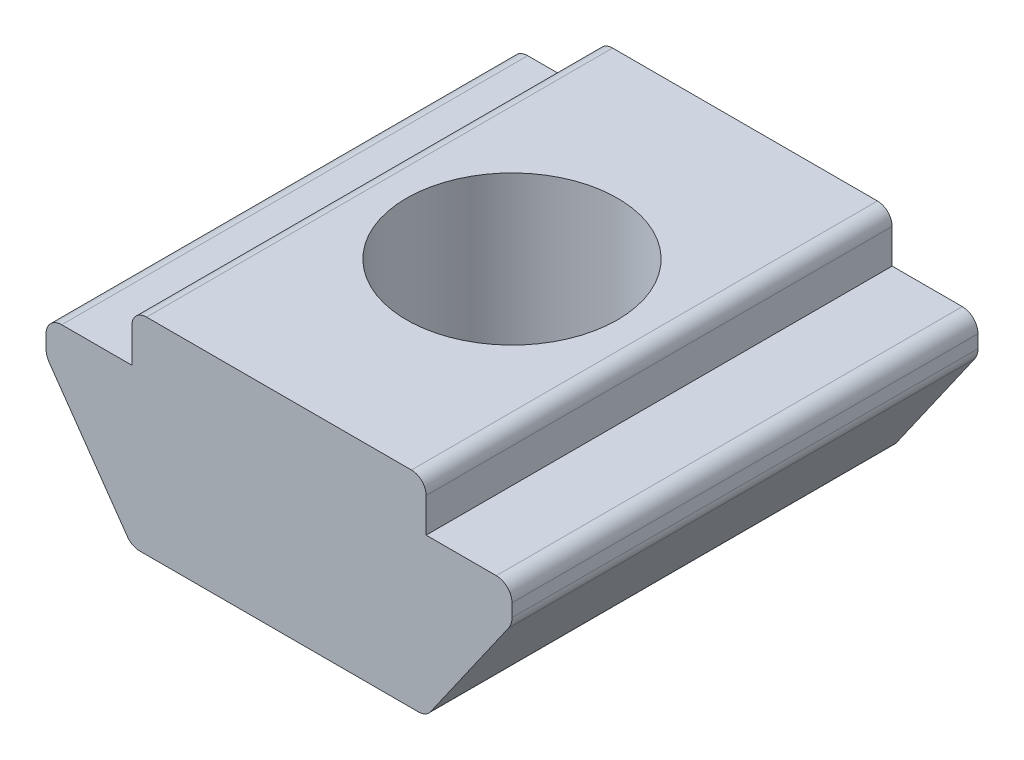
ISO-10303-21;
HEADER;
FILE_DESCRIPTION(('STEP AP214'),'2;1');
FILE_NAME('part.step','',(''),(''),'','','');
FILE_SCHEMA(('AUTOMOTIVE_DESIGN { 1 0 10303 214 1 1 1 1 }'));
ENDSEC;
DATA;
#1=APPLICATION_CONTEXT('core data for automotive mechanical design processes');
#2=APPLICATION_PROTOCOL_DEFINITION('international standard','automotive_design',2000,#1);
#3=PRODUCT_CONTEXT('',#1,'mechanical');
#4=PRODUCT('Part','Part','',(#3));
#5=PRODUCT_RELATED_PRODUCT_CATEGORY('part','',(#4));
#6=PRODUCT_DEFINITION_FORMATION('','',#4);
#7=PRODUCT_DEFINITION_CONTEXT('part definition',#1,'design');
#8=PRODUCT_DEFINITION('design','',#6,#7);
#9=PRODUCT_DEFINITION_SHAPE('','',#8);
#10=(LENGTH_UNIT() NAMED_UNIT(*) SI_UNIT(.MILLI.,.METRE.));
#11=(NAMED_UNIT(*) PLANE_ANGLE_UNIT() SI_UNIT($,.RADIAN.));
#12=(NAMED_UNIT(*) SI_UNIT($,.STERADIAN.) SOLID_ANGLE_UNIT());
#13=UNCERTAINTY_MEASURE_WITH_UNIT(LENGTH_MEASURE(1.E-05),#10,'distance_accuracy_value','');
#14=(GEOMETRIC_REPRESENTATION_CONTEXT(3) GLOBAL_UNCERTAINTY_ASSIGNED_CONTEXT((#13)) GLOBAL_UNIT_ASSIGNED_CONTEXT((#10,
#11,#12)) REPRESENTATION_CONTEXT('',''));
#15=CARTESIAN_POINT('',(0.,0.,0.));
#16=DIRECTION('',(0.,0.,1.));
#17=DIRECTION('',(1.,0.,0.));
#18=AXIS2_PLACEMENT_3D('',#15,#16,#17);
#19=CARTESIAN_POINT('',(4.375,-1.58250394237167,9.5));
#20=DIRECTION('',(0.,0.,-1.));
#21=DIRECTION('',(-1.,0.,0.));
#22=AXIS2_PLACEMENT_3D('',#19,#20,#21);
#23=CYLINDRICAL_SURFACE('',#22,0.375);
#24=CARTESIAN_POINT('',(4.375,-1.58250394237167,0.));
#25=DIRECTION('',(0.,0.,1.));
#26=DIRECTION('',(-1.,0.,0.));
#27=AXIS2_PLACEMENT_3D('',#24,#25,#26);
#28=CIRCLE('',#27,0.375);
#29=CARTESIAN_POINT('',(4.68218201660838,-1.79759510600332,0.));
#30=VERTEX_POINT('',#29);
#31=CARTESIAN_POINT('',(4.75,-1.58250394237167,0.));
#32=VERTEX_POINT('',#31);
#33=EDGE_CURVE('E214',#30,#32,#28,.T.);
#34=ORIENTED_EDGE('',*,*,#33,.T.);
#35=DIRECTION('',(0.,0.,-1.));
#36=VECTOR('',#35,1.);
#37=CARTESIAN_POINT('',(4.75,-1.58250394237167,9.5));
#38=LINE('',#37,#36);
#39=CARTESIAN_POINT('',(4.75,-1.58250394237167,9.5));
#40=VERTEX_POINT('',#39);
#41=EDGE_CURVE('E11',#40,#32,#38,.T.);
#42=ORIENTED_EDGE('',*,*,#41,.F.);
#43=CARTESIAN_POINT('',(4.375,-1.58250394237167,9.5));
#44=DIRECTION('',(0.,0.,1.));
#45=DIRECTION('',(-1.,0.,0.));
#46=AXIS2_PLACEMENT_3D('',#43,#44,#45);
#47=CIRCLE('',#46,0.375);
#48=CARTESIAN_POINT('',(4.68218201660838,-1.79759510600332,9.5));
#49=VERTEX_POINT('',#48);
#50=EDGE_CURVE('E267',#49,#40,#47,.T.);
#51=ORIENTED_EDGE('',*,*,#50,.F.);
#52=DIRECTION('',(0.,0.,-1.));
#53=VECTOR('',#52,1.);
#54=CARTESIAN_POINT('',(4.68218201660838,-1.79759510600332,9.5));
#55=LINE('',#54,#53);
#56=EDGE_CURVE('E210',#49,#30,#55,.T.);
#57=ORIENTED_EDGE('',*,*,#56,.T.);
#58=EDGE_LOOP('',(#34,#42,#51,#57));
#59=FACE_BOUND('',#58,.T.);
#60=ADVANCED_FACE('F51',(#59),#23,.T.);
#61=CARTESIAN_POINT('',(4.75,-1.32,9.5));
#62=DIRECTION('',(-1.,0.,0.));
#63=DIRECTION('',(0.,0.,1.));
#64=AXIS2_PLACEMENT_3D('',#61,#62,#63);
#65=PLANE('',#64);
#66=DIRECTION('',(0.,1.,0.));
#67=VECTOR('',#66,1.);
#68=CARTESIAN_POINT('',(4.75,-1.32,0.));
#69=LINE('',#68,#67);
#70=CARTESIAN_POINT('',(4.75,-1.32,0.));
#71=VERTEX_POINT('',#70);
#72=EDGE_CURVE('E218',#32,#71,#69,.T.);
#73=ORIENTED_EDGE('',*,*,#72,.T.);
#74=DIRECTION('',(0.,0.,-1.));
#75=VECTOR('',#74,1.);
#76=CARTESIAN_POINT('',(4.75,-1.32,9.5));
#77=LINE('',#76,#75);
#78=CARTESIAN_POINT('',(4.75,-1.32,9.5));
#79=VERTEX_POINT('',#78);
#80=EDGE_CURVE('E60',#79,#71,#77,.T.);
#81=ORIENTED_EDGE('',*,*,#80,.F.);
#82=DIRECTION('',(0.,1.,0.));
#83=VECTOR('',#82,1.);
#84=CARTESIAN_POINT('',(4.75,-1.32,9.5));
#85=LINE('',#84,#83);
#86=EDGE_CURVE('E141',#40,#79,#85,.T.);
#87=ORIENTED_EDGE('',*,*,#86,.F.);
#88=ORIENTED_EDGE('',*,*,#41,.T.);
#89=EDGE_LOOP('',(#73,#81,#87,#88));
#90=FACE_BOUND('',#89,.T.);
#91=ADVANCED_FACE('F501',(#90),#65,.F.);
#92=CARTESIAN_POINT('',(4.43,-1.32,9.5));
#93=DIRECTION('',(0.,0.,-1.));
#94=DIRECTION('',(-1.,0.,0.));
#95=AXIS2_PLACEMENT_3D('',#92,#93,#94);
#96=CYLINDRICAL_SURFACE('',#95,0.32);
#97=CARTESIAN_POINT('',(4.43,-1.32,0.));
#98=DIRECTION('',(0.,0.,1.));
#99=DIRECTION('',(-1.,0.,0.));
#100=AXIS2_PLACEMENT_3D('',#97,#98,#99);
#101=CIRCLE('',#100,0.32);
#102=CARTESIAN_POINT('',(4.43,-1.,0.));
#103=VERTEX_POINT('',#102);
#104=EDGE_CURVE('E222',#71,#103,#101,.T.);
#105=ORIENTED_EDGE('',*,*,#104,.T.);
#106=DIRECTION('',(0.,0.,-1.));
#107=VECTOR('',#106,1.);
#108=CARTESIAN_POINT('',(4.43,-1.,9.5));
#109=LINE('',#108,#107);
#110=CARTESIAN_POINT('',(4.43,-1.,9.5));
#111=VERTEX_POINT('',#110);
#112=EDGE_CURVE('E318',#111,#103,#109,.T.);
#113=ORIENTED_EDGE('',*,*,#112,.F.);
#114=CARTESIAN_POINT('',(4.43,-1.32,9.5));
#115=DIRECTION('',(0.,0.,1.));
#116=DIRECTION('',(-1.,0.,0.));
#117=AXIS2_PLACEMENT_3D('',#114,#115,#116);
#118=CIRCLE('',#117,0.32);
#119=EDGE_CURVE('E330',#79,#111,#118,.T.);
#120=ORIENTED_EDGE('',*,*,#119,.F.);
#121=ORIENTED_EDGE('',*,*,#80,.T.);
#122=EDGE_LOOP('',(#105,#113,#120,#121));
#123=FACE_BOUND('',#122,.T.);
#124=ADVANCED_FACE('F328',(#123),#96,.T.);
#125=CARTESIAN_POINT('',(3.,-1.,9.5));
#126=DIRECTION('',(0.,-1.,0.));
#127=DIRECTION('',(0.,0.,-1.));
#128=AXIS2_PLACEMENT_3D('',#125,#126,#127);
#129=PLANE('',#128);
#130=DIRECTION('',(-1.,0.,0.));
#131=VECTOR('',#130,1.);
#132=CARTESIAN_POINT('',(3.,-1.,0.));
#133=LINE('',#132,#131);
#134=CARTESIAN_POINT('',(3.,-1.,0.));
#135=VERTEX_POINT('',#134);
#136=EDGE_CURVE('E225',#103,#135,#133,.T.);
#137=ORIENTED_EDGE('',*,*,#136,.T.);
#138=DIRECTION('',(0.,0.,-1.));
#139=VECTOR('',#138,1.);
#140=CARTESIAN_POINT('',(3.,-1.,9.5));
#141=LINE('',#140,#139);
#142=CARTESIAN_POINT('',(3.,-1.,9.5));
#143=VERTEX_POINT('',#142);
#144=EDGE_CURVE('E314',#143,#135,#141,.T.);
#145=ORIENTED_EDGE('',*,*,#144,.F.);
#146=DIRECTION('',(-1.,0.,0.));
#147=VECTOR('',#146,1.);
#148=CARTESIAN_POINT('',(3.,-1.,9.5));
#149=LINE('',#148,#147);
#150=EDGE_CURVE('E349',#111,#143,#149,.T.);
#151=ORIENTED_EDGE('',*,*,#150,.F.);
#152=ORIENTED_EDGE('',*,*,#112,.T.);
#153=EDGE_LOOP('',(#137,#145,#151,#152));
#154=FACE_BOUND('',#153,.T.);
#155=ADVANCED_FACE('F339',(#154),#129,.F.);
#156=CARTESIAN_POINT('',(3.,-0.300000000000002,9.5));
#157=DIRECTION('',(-1.,0.,0.));
#158=DIRECTION('',(0.,-1.,0.));
#159=AXIS2_PLACEMENT_3D('',#156,#157,#158);
#160=PLANE('',#159);
#161=DIRECTION('',(0.,1.,0.));
#162=VECTOR('',#161,1.);
#163=CARTESIAN_POINT('',(3.,-0.300000000000002,0.));
#164=LINE('',#163,#162);
#165=CARTESIAN_POINT('',(3.,-0.300000000000002,0.));
#166=VERTEX_POINT('',#165);
#167=EDGE_CURVE('E228',#135,#166,#164,.T.);
#168=ORIENTED_EDGE('',*,*,#167,.T.);
#169=DIRECTION('',(0.,0.,-1.));
#170=VECTOR('',#169,1.);
#171=CARTESIAN_POINT('',(3.,-0.300000000000002,9.5));
#172=LINE('',#171,#170);
#173=CARTESIAN_POINT('',(3.,-0.300000000000002,9.5));
#174=VERTEX_POINT('',#173);
#175=EDGE_CURVE('E310',#174,#166,#172,.T.);
#176=ORIENTED_EDGE('',*,*,#175,.F.);
#177=DIRECTION('',(0.,1.,0.));
#178=VECTOR('',#177,1.);
#179=CARTESIAN_POINT('',(3.,-0.300000000000002,9.5));
#180=LINE('',#179,#178);
#181=EDGE_CURVE('E345',#143,#174,#180,.T.);
#182=ORIENTED_EDGE('',*,*,#181,.F.);
#183=ORIENTED_EDGE('',*,*,#144,.T.);
#184=EDGE_LOOP('',(#168,#176,#182,#183));
#185=FACE_BOUND('',#184,.T.);
#186=ADVANCED_FACE('F343',(#185),#160,.F.);
#187=CARTESIAN_POINT('',(2.7,-0.3,9.5));
#188=DIRECTION('',(0.,0.,-1.));
#189=DIRECTION('',(-1.,0.,0.));
#190=AXIS2_PLACEMENT_3D('',#187,#188,#189);
#191=CYLINDRICAL_SURFACE('',#190,0.3);
#192=CARTESIAN_POINT('',(2.7,-0.3,0.));
#193=DIRECTION('',(0.,0.,1.));
#194=DIRECTION('',(-1.,0.,0.));
#195=AXIS2_PLACEMENT_3D('',#192,#193,#194);
#196=CIRCLE('',#195,0.3);
#197=CARTESIAN_POINT('',(2.7,0.,0.));
#198=VERTEX_POINT('',#197);
#199=EDGE_CURVE('E231',#166,#198,#196,.T.);
#200=ORIENTED_EDGE('',*,*,#199,.T.);
#201=DIRECTION('',(0.,0.,-1.));
#202=VECTOR('',#201,1.);
#203=CARTESIAN_POINT('',(2.7,0.,9.5));
#204=LINE('',#203,#202);
#205=CARTESIAN_POINT('',(2.7,0.,9.5));
#206=VERTEX_POINT('',#205);
#207=EDGE_CURVE('E306',#206,#198,#204,.T.);
#208=ORIENTED_EDGE('',*,*,#207,.F.);
#209=CARTESIAN_POINT('',(2.7,-0.3,9.5));
#210=DIRECTION('',(0.,0.,1.));
#211=DIRECTION('',(-1.,0.,0.));
#212=AXIS2_PLACEMENT_3D('',#209,#210,#211);
#213=CIRCLE('',#212,0.3);
#214=EDGE_CURVE('E348',#174,#206,#213,.T.);
#215=ORIENTED_EDGE('',*,*,#214,.F.);
#216=ORIENTED_EDGE('',*,*,#175,.T.);
#217=EDGE_LOOP('',(#200,#208,#215,#216));
#218=FACE_BOUND('',#217,.T.);
#219=ADVANCED_FACE('F513',(#218),#191,.T.);
#220=CARTESIAN_POINT('',(-2.7,0.,9.5));
#221=DIRECTION('',(0.,-1.,0.));
#222=DIRECTION('',(1.,0.,0.));
#223=AXIS2_PLACEMENT_3D('',#220,#221,#222);
#224=PLANE('',#223);
#225=CARTESIAN_POINT('',(0.,0.,4.75));
#226=DIRECTION('',(0.,1.,0.));
#227=DIRECTION('',(-1.,0.,0.));
#228=AXIS2_PLACEMENT_3D('',#225,#226,#227);
#229=CIRCLE('',#228,2.15);
#230=CARTESIAN_POINT('',(-2.15,0.,4.75));
#231=VERTEX_POINT('',#230);
#232=EDGE_CURVE('E443',#231,#231,#229,.T.);
#233=ORIENTED_EDGE('',*,*,#232,.F.);
#234=EDGE_LOOP('',(#233));
#235=FACE_BOUND('',#234,.T.);
#236=DIRECTION('',(-1.,0.,0.));
#237=VECTOR('',#236,1.);
#238=CARTESIAN_POINT('',(-2.7,0.,0.));
#239=LINE('',#238,#237);
#240=CARTESIAN_POINT('',(-2.7,0.,0.));
#241=VERTEX_POINT('',#240);
#242=EDGE_CURVE('E234',#198,#241,#239,.T.);
#243=ORIENTED_EDGE('',*,*,#242,.T.);
#244=DIRECTION('',(0.,0.,-1.));
#245=VECTOR('',#244,1.);
#246=CARTESIAN_POINT('',(-2.7,0.,9.5));
#247=LINE('',#246,#245);
#248=CARTESIAN_POINT('',(-2.7,0.,9.5));
#249=VERTEX_POINT('',#248);
#250=EDGE_CURVE('E302',#249,#241,#247,.T.);
#251=ORIENTED_EDGE('',*,*,#250,.F.);
#252=DIRECTION('',(-1.,0.,0.));
#253=VECTOR('',#252,1.);
#254=CARTESIAN_POINT('',(-2.7,0.,9.5));
#255=LINE('',#254,#253);
#256=EDGE_CURVE('E355',#206,#249,#255,.T.);
#257=ORIENTED_EDGE('',*,*,#256,.F.);
#258=ORIENTED_EDGE('',*,*,#207,.T.);
#259=EDGE_LOOP('',(#243,#251,#257,#258));
#260=FACE_BOUND('',#259,.T.);
#261=ADVANCED_FACE('F516',(#235,#260),#224,.F.);
#262=CARTESIAN_POINT('',(-2.7,-0.299999999999986,9.5));
#263=DIRECTION('',(0.,0.,-1.));
#264=DIRECTION('',(-1.,0.,0.));
#265=AXIS2_PLACEMENT_3D('',#262,#263,#264);
#266=CYLINDRICAL_SURFACE('',#265,0.3);
#267=CARTESIAN_POINT('',(-2.7,-0.299999999999986,0.));
#268=DIRECTION('',(0.,0.,1.));
#269=DIRECTION('',(1.,0.,0.));
#270=AXIS2_PLACEMENT_3D('',#267,#268,#269);
#271=CIRCLE('',#270,0.3);
#272=CARTESIAN_POINT('',(-3.,-0.299999999999988,0.));
#273=VERTEX_POINT('',#272);
#274=EDGE_CURVE('E237',#241,#273,#271,.T.);
#275=ORIENTED_EDGE('',*,*,#274,.T.);
#276=DIRECTION('',(0.,0.,-1.));
#277=VECTOR('',#276,1.);
#278=CARTESIAN_POINT('',(-3.,-0.299999999999988,9.5));
#279=LINE('',#278,#277);
#280=CARTESIAN_POINT('',(-3.,-0.299999999999988,9.5));
#281=VERTEX_POINT('',#280);
#282=EDGE_CURVE('E298',#281,#273,#279,.T.);
#283=ORIENTED_EDGE('',*,*,#282,.F.);
#284=CARTESIAN_POINT('',(-2.7,-0.299999999999986,9.5));
#285=DIRECTION('',(0.,0.,1.));
#286=DIRECTION('',(1.,0.,0.));
#287=AXIS2_PLACEMENT_3D('',#284,#285,#286);
#288=CIRCLE('',#287,0.3);
#289=EDGE_CURVE('E362',#249,#281,#288,.T.);
#290=ORIENTED_EDGE('',*,*,#289,.F.);
#291=ORIENTED_EDGE('',*,*,#250,.T.);
#292=EDGE_LOOP('',(#275,#283,#290,#291));
#293=FACE_BOUND('',#292,.T.);
#294=ADVANCED_FACE('F520',(#293),#266,.T.);
#295=CARTESIAN_POINT('',(-3.,-0.299999999999988,9.5));
#296=DIRECTION('',(1.,0.,0.));
#297=DIRECTION('',(0.,1.,0.));
#298=AXIS2_PLACEMENT_3D('',#295,#296,#297);
#299=PLANE('',#298);
#300=DIRECTION('',(0.,-1.,0.));
#301=VECTOR('',#300,1.);
#302=CARTESIAN_POINT('',(-3.,-0.299999999999988,0.));
#303=LINE('',#302,#301);
#304=CARTESIAN_POINT('',(-3.,-0.999999999999986,0.));
#305=VERTEX_POINT('',#304);
#306=EDGE_CURVE('E240',#273,#305,#303,.T.);
#307=ORIENTED_EDGE('',*,*,#306,.T.);
#308=DIRECTION('',(0.,0.,-1.));
#309=VECTOR('',#308,1.);
#310=CARTESIAN_POINT('',(-3.,-0.999999999999986,9.5));
#311=LINE('',#310,#309);
#312=CARTESIAN_POINT('',(-3.,-0.999999999999986,9.5));
#313=VERTEX_POINT('',#312);
#314=EDGE_CURVE('E294',#313,#305,#311,.T.);
#315=ORIENTED_EDGE('',*,*,#314,.F.);
#316=DIRECTION('',(0.,-1.,0.));
#317=VECTOR('',#316,1.);
#318=CARTESIAN_POINT('',(-3.,-0.299999999999988,9.5));
#319=LINE('',#318,#317);
#320=EDGE_CURVE('E365',#281,#313,#319,.T.);
#321=ORIENTED_EDGE('',*,*,#320,.F.);
#322=ORIENTED_EDGE('',*,*,#282,.T.);
#323=EDGE_LOOP('',(#307,#315,#321,#322));
#324=FACE_BOUND('',#323,.T.);
#325=ADVANCED_FACE('F524',(#324),#299,.F.);
#326=CARTESIAN_POINT('',(-3.,-0.999999999999986,9.5));
#327=DIRECTION('',(0.,-1.,0.));
#328=DIRECTION('',(0.,0.,-1.));
#329=AXIS2_PLACEMENT_3D('',#326,#327,#328);
#330=PLANE('',#329);
#331=DIRECTION('',(-1.,0.,0.));
#332=VECTOR('',#331,1.);
#333=CARTESIAN_POINT('',(-3.,-0.999999999999986,0.));
#334=LINE('',#333,#332);
#335=CARTESIAN_POINT('',(-4.43,-0.999999999999986,0.));
#336=VERTEX_POINT('',#335);
#337=EDGE_CURVE('E243',#305,#336,#334,.T.);
#338=ORIENTED_EDGE('',*,*,#337,.T.);
#339=DIRECTION('',(0.,0.,-1.));
#340=VECTOR('',#339,1.);
#341=CARTESIAN_POINT('',(-4.43,-0.999999999999986,9.5));
#342=LINE('',#341,#340);
#343=CARTESIAN_POINT('',(-4.43,-0.999999999999986,9.5));
#344=VERTEX_POINT('',#343);
#345=EDGE_CURVE('E290',#344,#336,#342,.T.);
#346=ORIENTED_EDGE('',*,*,#345,.F.);
#347=DIRECTION('',(-1.,0.,0.));
#348=VECTOR('',#347,1.);
#349=CARTESIAN_POINT('',(-3.,-0.999999999999986,9.5));
#350=LINE('',#349,#348);
#351=EDGE_CURVE('E368',#313,#344,#350,.T.);
#352=ORIENTED_EDGE('',*,*,#351,.F.);
#353=ORIENTED_EDGE('',*,*,#314,.T.);
#354=EDGE_LOOP('',(#338,#346,#352,#353));
#355=FACE_BOUND('',#354,.T.);
#356=ADVANCED_FACE('F528',(#355),#330,.F.);
#357=CARTESIAN_POINT('',(-4.43,-1.31999999999999,9.5));
#358=DIRECTION('',(0.,0.,-1.));
#359=DIRECTION('',(-1.,0.,0.));
#360=AXIS2_PLACEMENT_3D('',#357,#358,#359);
#361=CYLINDRICAL_SURFACE('',#360,0.32);
#362=CARTESIAN_POINT('',(-4.43,-1.31999999999999,0.));
#363=DIRECTION('',(0.,0.,1.));
#364=DIRECTION('',(1.,0.,0.));
#365=AXIS2_PLACEMENT_3D('',#362,#363,#364);
#366=CIRCLE('',#365,0.32);
#367=CARTESIAN_POINT('',(-4.75,-1.31999999999999,0.));
#368=VERTEX_POINT('',#367);
#369=EDGE_CURVE('E246',#336,#368,#366,.T.);
#370=ORIENTED_EDGE('',*,*,#369,.T.);
#371=DIRECTION('',(0.,0.,-1.));
#372=VECTOR('',#371,1.);
#373=CARTESIAN_POINT('',(-4.75,-1.31999999999999,9.5));
#374=LINE('',#373,#372);
#375=CARTESIAN_POINT('',(-4.75,-1.31999999999999,9.5));
#376=VERTEX_POINT('',#375);
#377=EDGE_CURVE('E286',#376,#368,#374,.T.);
#378=ORIENTED_EDGE('',*,*,#377,.F.);
#379=CARTESIAN_POINT('',(-4.43,-1.31999999999999,9.5));
#380=DIRECTION('',(0.,0.,1.));
#381=DIRECTION('',(1.,0.,0.));
#382=AXIS2_PLACEMENT_3D('',#379,#380,#381);
#383=CIRCLE('',#382,0.32);
#384=EDGE_CURVE('E371',#344,#376,#383,.T.);
#385=ORIENTED_EDGE('',*,*,#384,.F.);
#386=ORIENTED_EDGE('',*,*,#345,.T.);
#387=EDGE_LOOP('',(#370,#378,#385,#386));
#388=FACE_BOUND('',#387,.T.);
#389=ADVANCED_FACE('F532',(#388),#361,.T.);
#390=CARTESIAN_POINT('',(-4.75,-1.31999999999999,9.5));
#391=DIRECTION('',(1.,0.,0.));
#392=DIRECTION('',(0.,0.,-1.));
#393=AXIS2_PLACEMENT_3D('',#390,#391,#392);
#394=PLANE('',#393);
#395=DIRECTION('',(0.,-1.,0.));
#396=VECTOR('',#395,1.);
#397=CARTESIAN_POINT('',(-4.75,-1.31999999999999,0.));
#398=LINE('',#397,#396);
#399=CARTESIAN_POINT('',(-4.75,-1.58250394237166,0.));
#400=VERTEX_POINT('',#399);
#401=EDGE_CURVE('E249',#368,#400,#398,.T.);
#402=ORIENTED_EDGE('',*,*,#401,.T.);
#403=DIRECTION('',(0.,0.,-1.));
#404=VECTOR('',#403,1.);
#405=CARTESIAN_POINT('',(-4.75,-1.58250394237166,9.5));
#406=LINE('',#405,#404);
#407=CARTESIAN_POINT('',(-4.75,-1.58250394237166,9.5));
#408=VERTEX_POINT('',#407);
#409=EDGE_CURVE('E282',#408,#400,#406,.T.);
#410=ORIENTED_EDGE('',*,*,#409,.F.);
#411=DIRECTION('',(0.,-1.,0.));
#412=VECTOR('',#411,1.);
#413=CARTESIAN_POINT('',(-4.75,-1.31999999999999,9.5));
#414=LINE('',#413,#412);
#415=EDGE_CURVE('E374',#376,#408,#414,.T.);
#416=ORIENTED_EDGE('',*,*,#415,.F.);
#417=ORIENTED_EDGE('',*,*,#377,.T.);
#418=EDGE_LOOP('',(#402,#410,#416,#417));
#419=FACE_BOUND('',#418,.T.);
#420=ADVANCED_FACE('F536',(#419),#394,.F.);
#421=CARTESIAN_POINT('',(-4.375,-1.58250394237166,9.5));
#422=DIRECTION('',(0.,0.,-1.));
#423=DIRECTION('',(-1.,0.,0.));
#424=AXIS2_PLACEMENT_3D('',#421,#422,#423);
#425=CYLINDRICAL_SURFACE('',#424,0.375);
#426=CARTESIAN_POINT('',(-4.375,-1.58250394237166,0.));
#427=DIRECTION('',(0.,0.,1.));
#428=DIRECTION('',(1.,0.,0.));
#429=AXIS2_PLACEMENT_3D('',#426,#427,#428);
#430=CIRCLE('',#429,0.375);
#431=CARTESIAN_POINT('',(-4.68218201660838,-1.7975951060033,0.));
#432=VERTEX_POINT('',#431);
#433=EDGE_CURVE('E252',#400,#432,#430,.T.);
#434=ORIENTED_EDGE('',*,*,#433,.T.);
#435=DIRECTION('',(0.,0.,-1.));
#436=VECTOR('',#435,1.);
#437=CARTESIAN_POINT('',(-4.68218201660838,-1.7975951060033,9.5));
#438=LINE('',#437,#436);
#439=CARTESIAN_POINT('',(-4.68218201660838,-1.7975951060033,9.5));
#440=VERTEX_POINT('',#439);
#441=EDGE_CURVE('E278',#440,#432,#438,.T.);
#442=ORIENTED_EDGE('',*,*,#441,.F.);
#443=CARTESIAN_POINT('',(-4.375,-1.58250394237166,9.5));
#444=DIRECTION('',(0.,0.,1.));
#445=DIRECTION('',(1.,0.,0.));
#446=AXIS2_PLACEMENT_3D('',#443,#444,#445);
#447=CIRCLE('',#446,0.375);
#448=EDGE_CURVE('E377',#408,#440,#447,.T.);
#449=ORIENTED_EDGE('',*,*,#448,.F.);
#450=ORIENTED_EDGE('',*,*,#409,.T.);
#451=EDGE_LOOP('',(#434,#442,#449,#450));
#452=FACE_BOUND('',#451,.T.);
#453=ADVANCED_FACE('F540',(#452),#425,.T.);
#454=CARTESIAN_POINT('',(-4.68218201660838,-1.7975951060033,9.5));
#455=DIRECTION('',(0.819152044288993,0.573576436351045,0.));
#456=DIRECTION('',(-0.573576436351045,0.819152044288993,0.));
#457=AXIS2_PLACEMENT_3D('',#454,#455,#456);
#458=PLANE('',#457);
#459=DIRECTION('',(0.573576436351045,-0.819152044288993,0.));
#460=VECTOR('',#459,1.);
#461=CARTESIAN_POINT('',(-4.68218201660838,-1.7975951060033,0.));
#462=LINE('',#461,#460);
#463=CARTESIAN_POINT('',(-3.08957549812118,-4.0720729309053,0.));
#464=VERTEX_POINT('',#463);
#465=EDGE_CURVE('E255',#432,#464,#462,.T.);
#466=ORIENTED_EDGE('',*,*,#465,.T.);
#467=DIRECTION('',(0.,0.,-1.));
#468=VECTOR('',#467,1.);
#469=CARTESIAN_POINT('',(-3.08957549812118,-4.0720729309053,9.5));
#470=LINE('',#469,#468);
#471=CARTESIAN_POINT('',(-3.08957549812118,-4.0720729309053,9.5));
#472=VERTEX_POINT('',#471);
#473=EDGE_CURVE('E274',#472,#464,#470,.T.);
#474=ORIENTED_EDGE('',*,*,#473,.F.);
#475=DIRECTION('',(0.573576436351045,-0.819152044288993,0.));
#476=VECTOR('',#475,1.);
#477=CARTESIAN_POINT('',(-4.68218201660838,-1.7975951060033,9.5));
#478=LINE('',#477,#476);
#479=EDGE_CURVE('E380',#440,#472,#478,.T.);
#480=ORIENTED_EDGE('',*,*,#479,.F.);
#481=ORIENTED_EDGE('',*,*,#441,.T.);
#482=EDGE_LOOP('',(#466,#474,#480,#481));
#483=FACE_BOUND('',#482,.T.);
#484=ADVANCED_FACE('F544',(#483),#458,.F.);
#485=CARTESIAN_POINT('',(-2.84382988483448,-3.89999999999999,9.5));
#486=DIRECTION('',(0.,0.,-1.));
#487=DIRECTION('',(-1.,0.,0.));
#488=AXIS2_PLACEMENT_3D('',#485,#486,#487);
#489=CYLINDRICAL_SURFACE('',#488,0.3);
#490=CARTESIAN_POINT('',(-2.84382988483448,-3.89999999999999,0.));
#491=DIRECTION('',(0.,0.,1.));
#492=DIRECTION('',(1.,0.,0.));
#493=AXIS2_PLACEMENT_3D('',#490,#491,#492);
#494=CIRCLE('',#493,0.3);
#495=CARTESIAN_POINT('',(-2.84382988483448,-4.19999999999999,0.));
#496=VERTEX_POINT('',#495);
#497=EDGE_CURVE('E258',#464,#496,#494,.T.);
#498=ORIENTED_EDGE('',*,*,#497,.T.);
#499=DIRECTION('',(0.,0.,-1.));
#500=VECTOR('',#499,1.);
#501=CARTESIAN_POINT('',(-2.84382988483448,-4.19999999999999,9.5));
#502=LINE('',#501,#500);
#503=CARTESIAN_POINT('',(-2.84382988483448,-4.19999999999999,9.5));
#504=VERTEX_POINT('',#503);
#505=EDGE_CURVE('E201',#504,#496,#502,.T.);
#506=ORIENTED_EDGE('',*,*,#505,.F.);
#507=CARTESIAN_POINT('',(-2.84382988483448,-3.89999999999999,9.5));
#508=DIRECTION('',(0.,0.,1.));
#509=DIRECTION('',(1.,0.,0.));
#510=AXIS2_PLACEMENT_3D('',#507,#508,#509);
#511=CIRCLE('',#510,0.3);
#512=EDGE_CURVE('E190',#472,#504,#511,.T.);
#513=ORIENTED_EDGE('',*,*,#512,.F.);
#514=ORIENTED_EDGE('',*,*,#473,.T.);
#515=EDGE_LOOP('',(#498,#506,#513,#514));
#516=FACE_BOUND('',#515,.T.);
#517=ADVANCED_FACE('F548',(#516),#489,.T.);
#518=CARTESIAN_POINT('',(2.84382988483448,-4.2,9.5));
#519=DIRECTION('',(0.,1.,0.));
#520=DIRECTION('',(-1.,0.,0.));
#521=AXIS2_PLACEMENT_3D('',#518,#519,#520);
#522=PLANE('',#521);
#523=CARTESIAN_POINT('',(0.,-4.19999999999999,4.75));
#524=DIRECTION('',(0.,1.,0.));
#525=DIRECTION('',(-1.,0.,0.));
#526=AXIS2_PLACEMENT_3D('',#523,#524,#525);
#527=CIRCLE('',#526,2.15);
#528=CARTESIAN_POINT('',(-2.15000000000001,-4.19999999999999,4.75));
#529=VERTEX_POINT('',#528);
#530=EDGE_CURVE('E219',#529,#529,#527,.F.);
#531=ORIENTED_EDGE('',*,*,#530,.F.);
#532=EDGE_LOOP('',(#531));
#533=FACE_BOUND('',#532,.T.);
#534=DIRECTION('',(1.,0.,0.));
#535=VECTOR('',#534,1.);
#536=CARTESIAN_POINT('',(2.84382988483448,-4.2,0.));
#537=LINE('',#536,#535);
#538=CARTESIAN_POINT('',(2.84382988483448,-4.2,0.));
#539=VERTEX_POINT('',#538);
#540=EDGE_CURVE('E199',#496,#539,#537,.T.);
#541=ORIENTED_EDGE('',*,*,#540,.T.);
#542=DIRECTION('',(0.,0.,-1.));
#543=VECTOR('',#542,1.);
#544=CARTESIAN_POINT('',(2.84382988483448,-4.2,9.5));
#545=LINE('',#544,#543);
#546=CARTESIAN_POINT('',(2.84382988483448,-4.2,9.5));
#547=VERTEX_POINT('',#546);
#548=EDGE_CURVE('E196',#547,#539,#545,.T.);
#549=ORIENTED_EDGE('',*,*,#548,.F.);
#550=DIRECTION('',(1.,0.,0.));
#551=VECTOR('',#550,1.);
#552=CARTESIAN_POINT('',(2.84382988483448,-4.2,9.5));
#553=LINE('',#552,#551);
#554=EDGE_CURVE('E184',#504,#547,#553,.T.);
#555=ORIENTED_EDGE('',*,*,#554,.F.);
#556=ORIENTED_EDGE('',*,*,#505,.T.);
#557=EDGE_LOOP('',(#541,#549,#555,#556));
#558=FACE_BOUND('',#557,.T.);
#559=ADVANCED_FACE('F197',(#533,#558),#522,.F.);
#560=CARTESIAN_POINT('',(2.84382988483448,-3.9,9.5));
#561=DIRECTION('',(0.,0.,-1.));
#562=DIRECTION('',(-1.,0.,0.));
#563=AXIS2_PLACEMENT_3D('',#560,#561,#562);
#564=CYLINDRICAL_SURFACE('',#563,0.3);
#565=CARTESIAN_POINT('',(2.84382988483448,-3.9,0.));
#566=DIRECTION('',(0.,0.,1.));
#567=DIRECTION('',(-1.,0.,0.));
#568=AXIS2_PLACEMENT_3D('',#565,#566,#567);
#569=CIRCLE('',#568,0.3);
#570=CARTESIAN_POINT('',(3.08957549812118,-4.07207293090531,0.));
#571=VERTEX_POINT('',#570);
#572=EDGE_CURVE('E127',#539,#571,#569,.T.);
#573=ORIENTED_EDGE('',*,*,#572,.T.);
#574=DIRECTION('',(0.,0.,-1.));
#575=VECTOR('',#574,1.);
#576=CARTESIAN_POINT('',(3.08957549812118,-4.07207293090531,9.5));
#577=LINE('',#576,#575);
#578=CARTESIAN_POINT('',(3.08957549812118,-4.07207293090531,9.5));
#579=VERTEX_POINT('',#578);
#580=EDGE_CURVE('E202',#579,#571,#577,.T.);
#581=ORIENTED_EDGE('',*,*,#580,.F.);
#582=CARTESIAN_POINT('',(2.84382988483448,-3.9,9.5));
#583=DIRECTION('',(0.,0.,1.));
#584=DIRECTION('',(-1.,0.,0.));
#585=AXIS2_PLACEMENT_3D('',#582,#583,#584);
#586=CIRCLE('',#585,0.3);
#587=EDGE_CURVE('E188',#547,#579,#586,.T.);
#588=ORIENTED_EDGE('',*,*,#587,.F.);
#589=ORIENTED_EDGE('',*,*,#548,.T.);
#590=EDGE_LOOP('',(#573,#581,#588,#589));
#591=FACE_BOUND('',#590,.T.);
#592=ADVANCED_FACE('F204',(#591),#564,.T.);
#593=CARTESIAN_POINT('',(4.68218201660838,-1.79759510600332,9.5));
#594=DIRECTION('',(-0.819152044288993,0.573576436351045,0.));
#595=DIRECTION('',(-0.573576436351045,-0.819152044288993,0.));
#596=AXIS2_PLACEMENT_3D('',#593,#594,#595);
#597=PLANE('',#596);
#598=DIRECTION('',(0.573576436351045,0.819152044288993,0.));
#599=VECTOR('',#598,1.);
#600=CARTESIAN_POINT('',(4.68218201660838,-1.79759510600332,0.));
#601=LINE('',#600,#599);
#602=EDGE_CURVE('E133',#571,#30,#601,.T.);
#603=ORIENTED_EDGE('',*,*,#602,.T.);
#604=ORIENTED_EDGE('',*,*,#56,.F.);
#605=DIRECTION('',(0.573576436351045,0.819152044288993,0.));
#606=VECTOR('',#605,1.);
#607=CARTESIAN_POINT('',(4.68218201660838,-1.79759510600332,9.5));
#608=LINE('',#607,#606);
#609=EDGE_CURVE('E68',#579,#49,#608,.T.);
#610=ORIENTED_EDGE('',*,*,#609,.F.);
#611=ORIENTED_EDGE('',*,*,#580,.T.);
#612=EDGE_LOOP('',(#603,#604,#610,#611));
#613=FACE_BOUND('',#612,.T.);
#614=ADVANCED_FACE('F558',(#613),#597,.F.);
#615=CARTESIAN_POINT('',(4.375,-1.58250394237167,9.5));
#616=DIRECTION('',(0.,0.,-1.));
#617=DIRECTION('',(-1.,0.,0.));
#618=AXIS2_PLACEMENT_3D('',#615,#616,#617);
#619=PLANE('',#618);
#620=ORIENTED_EDGE('',*,*,#50,.T.);
#621=ORIENTED_EDGE('',*,*,#86,.T.);
#622=ORIENTED_EDGE('',*,*,#119,.T.);
#623=ORIENTED_EDGE('',*,*,#150,.T.);
#624=ORIENTED_EDGE('',*,*,#181,.T.);
#625=ORIENTED_EDGE('',*,*,#214,.T.);
#626=ORIENTED_EDGE('',*,*,#256,.T.);
#627=ORIENTED_EDGE('',*,*,#289,.T.);
#628=ORIENTED_EDGE('',*,*,#320,.T.);
#629=ORIENTED_EDGE('',*,*,#351,.T.);
#630=ORIENTED_EDGE('',*,*,#384,.T.);
#631=ORIENTED_EDGE('',*,*,#415,.T.);
#632=ORIENTED_EDGE('',*,*,#448,.T.);
#633=ORIENTED_EDGE('',*,*,#479,.T.);
#634=ORIENTED_EDGE('',*,*,#512,.T.);
#635=ORIENTED_EDGE('',*,*,#554,.T.);
#636=ORIENTED_EDGE('',*,*,#587,.T.);
#637=ORIENTED_EDGE('',*,*,#609,.T.);
#638=EDGE_LOOP('',(#620,#621,#622,#623,#624,#625,#626,#627,#628,#629,#630,#631,#632,#633,#634,
#635,#636,#637));
#639=FACE_BOUND('',#638,.T.);
#640=ADVANCED_FACE('F186',(#639),#619,.F.);
#641=CARTESIAN_POINT('',(4.375,-1.58250394237167,0.));
#642=DIRECTION('',(0.,0.,-1.));
#643=DIRECTION('',(-1.,0.,0.));
#644=AXIS2_PLACEMENT_3D('',#641,#642,#643);
#645=PLANE('',#644);
#646=ORIENTED_EDGE('',*,*,#33,.F.);
#647=ORIENTED_EDGE('',*,*,#602,.F.);
#648=ORIENTED_EDGE('',*,*,#572,.F.);
#649=ORIENTED_EDGE('',*,*,#540,.F.);
#650=ORIENTED_EDGE('',*,*,#497,.F.);
#651=ORIENTED_EDGE('',*,*,#465,.F.);
#652=ORIENTED_EDGE('',*,*,#433,.F.);
#653=ORIENTED_EDGE('',*,*,#401,.F.);
#654=ORIENTED_EDGE('',*,*,#369,.F.);
#655=ORIENTED_EDGE('',*,*,#337,.F.);
#656=ORIENTED_EDGE('',*,*,#306,.F.);
#657=ORIENTED_EDGE('',*,*,#274,.F.);
#658=ORIENTED_EDGE('',*,*,#242,.F.);
#659=ORIENTED_EDGE('',*,*,#199,.F.);
#660=ORIENTED_EDGE('',*,*,#167,.F.);
#661=ORIENTED_EDGE('',*,*,#136,.F.);
#662=ORIENTED_EDGE('',*,*,#104,.F.);
#663=ORIENTED_EDGE('',*,*,#72,.F.);
#664=EDGE_LOOP('',(#646,#647,#648,#649,#650,#651,#652,#653,#654,#655,#656,#657,#658,#659,#660,
#661,#662,#663));
#665=FACE_BOUND('',#664,.T.);
#666=ADVANCED_FACE('F334',(#665),#645,.T.);
#667=CARTESIAN_POINT('',(0.,-4.20100000000001,4.75));
#668=DIRECTION('',(0.,1.,0.));
#669=DIRECTION('',(-1.,0.,0.));
#670=AXIS2_PLACEMENT_3D('',#667,#668,#669);
#671=CYLINDRICAL_SURFACE('',#670,2.15);
#672=CARTESIAN_POINT('',(-2.15,0.,4.75));
#673=CARTESIAN_POINT('',(-2.15,-0.0437499999999938,4.75));
#674=CARTESIAN_POINT('',(-2.15,-0.0874999999999935,4.75));
#675=CARTESIAN_POINT('',(-2.15,-0.174999999999993,4.75));
#676=CARTESIAN_POINT('',(-2.15,-0.218749999999994,4.75));
#677=CARTESIAN_POINT('',(-2.15,-0.306249999999993,4.75));
#678=CARTESIAN_POINT('',(-2.15,-0.349999999999993,4.75));
#679=CARTESIAN_POINT('',(-2.15,-0.437499999999993,4.75));
#680=CARTESIAN_POINT('',(-2.15,-0.481249999999993,4.75));
#681=CARTESIAN_POINT('',(-2.15,-0.568749999999993,4.75));
#682=CARTESIAN_POINT('',(-2.15,-0.612499999999993,4.75));
#683=CARTESIAN_POINT('',(-2.15,-0.699999999999993,4.75));
#684=CARTESIAN_POINT('',(-2.15,-0.743749999999993,4.75));
#685=CARTESIAN_POINT('',(-2.15,-0.831249999999993,4.75));
#686=CARTESIAN_POINT('',(-2.15,-0.874999999999993,4.75));
#687=CARTESIAN_POINT('',(-2.15,-0.962499999999992,4.75));
#688=CARTESIAN_POINT('',(-2.15,-1.00624999999999,4.75));
#689=CARTESIAN_POINT('',(-2.15,-1.09374999999999,4.75));
#690=CARTESIAN_POINT('',(-2.15,-1.13749999999999,4.75));
#691=CARTESIAN_POINT('',(-2.15,-1.22499999999999,4.75));
#692=CARTESIAN_POINT('',(-2.15,-1.26874999999999,4.75));
#693=CARTESIAN_POINT('',(-2.15,-1.35624999999999,4.75));
#694=CARTESIAN_POINT('',(-2.15,-1.39999999999999,4.75));
#695=CARTESIAN_POINT('',(-2.15,-1.48749999999999,4.75));
#696=CARTESIAN_POINT('',(-2.15,-1.53124999999999,4.75));
#697=CARTESIAN_POINT('',(-2.15,-1.61874999999999,4.75));
#698=CARTESIAN_POINT('',(-2.15,-1.66249999999999,4.75));
#699=CARTESIAN_POINT('',(-2.15,-1.74999999999999,4.75));
#700=CARTESIAN_POINT('',(-2.15,-1.79374999999999,4.75));
#701=CARTESIAN_POINT('',(-2.15,-1.88124999999999,4.75));
#702=CARTESIAN_POINT('',(-2.15,-1.92499999999999,4.75));
#703=CARTESIAN_POINT('',(-2.15,-2.01249999999999,4.75));
#704=CARTESIAN_POINT('',(-2.15,-2.05624999999999,4.75));
#705=CARTESIAN_POINT('',(-2.15,-2.14374999999999,4.75));
#706=CARTESIAN_POINT('',(-2.15,-2.18749999999999,4.75));
#707=CARTESIAN_POINT('',(-2.15,-2.27499999999999,4.75));
#708=CARTESIAN_POINT('',(-2.15000000000001,-2.31874999999999,4.75));
#709=CARTESIAN_POINT('',(-2.15000000000001,-2.40624999999999,4.75));
#710=CARTESIAN_POINT('',(-2.15000000000001,-2.44999999999999,4.75));
#711=CARTESIAN_POINT('',(-2.15000000000001,-2.53749999999999,4.75));
#712=CARTESIAN_POINT('',(-2.15000000000001,-2.58124999999999,4.75));
#713=CARTESIAN_POINT('',(-2.15000000000001,-2.66874999999999,4.75));
#714=CARTESIAN_POINT('',(-2.15000000000001,-2.71249999999999,4.75));
#715=CARTESIAN_POINT('',(-2.15000000000001,-2.79999999999999,4.75));
#716=CARTESIAN_POINT('',(-2.15000000000001,-2.84374999999999,4.75));
#717=CARTESIAN_POINT('',(-2.15000000000001,-2.93124999999999,4.75));
#718=CARTESIAN_POINT('',(-2.15000000000001,-2.97499999999999,4.75));
#719=CARTESIAN_POINT('',(-2.15000000000001,-3.06249999999999,4.75));
#720=CARTESIAN_POINT('',(-2.15000000000001,-3.10624999999999,4.75));
#721=CARTESIAN_POINT('',(-2.15000000000001,-3.19374999999999,4.75));
#722=CARTESIAN_POINT('',(-2.15000000000001,-3.23749999999999,4.75));
#723=CARTESIAN_POINT('',(-2.15000000000001,-3.32499999999999,4.75));
#724=CARTESIAN_POINT('',(-2.15000000000001,-3.36874999999999,4.75));
#725=CARTESIAN_POINT('',(-2.15000000000001,-3.45624999999999,4.75));
#726=CARTESIAN_POINT('',(-2.15000000000001,-3.49999999999999,4.75));
#727=CARTESIAN_POINT('',(-2.15000000000001,-3.58749999999999,4.75));
#728=CARTESIAN_POINT('',(-2.15000000000001,-3.63124999999999,4.75));
#729=CARTESIAN_POINT('',(-2.15000000000001,-3.71874999999999,4.75));
#730=CARTESIAN_POINT('',(-2.15000000000001,-3.76249999999999,4.75));
#731=CARTESIAN_POINT('',(-2.15000000000001,-3.84999999999999,4.75));
#732=CARTESIAN_POINT('',(-2.15000000000001,-3.89374999999999,4.75));
#733=CARTESIAN_POINT('',(-2.15000000000001,-3.98124999999999,4.75));
#734=CARTESIAN_POINT('',(-2.15000000000001,-4.02499999999999,4.75));
#735=CARTESIAN_POINT('',(-2.15000000000001,-4.11249999999999,4.75));
#736=CARTESIAN_POINT('',(-2.15000000000001,-4.15624999999999,4.75));
#737=CARTESIAN_POINT('',(-2.15000000000001,-4.19999999999999,4.75));
#738=B_SPLINE_CURVE_WITH_KNOTS('',3,(#672,#673,#674,#675,#676,#677,#678,#679,#680,#681,#682,
#683,#684,#685,#686,#687,#688,#689,#690,#691,#692,#693,#694,#695,#696,#697,#698,#699,#700,#701,
#702,#703,#704,#705,#706,#707,#708,#709,#710,#711,#712,#713,#714,#715,#716,#717,#718,#719,#720,
#721,#722,#723,#724,#725,#726,#727,#728,#729,#730,#731,#732,#733,#734,#735,#736,#737),
.UNSPECIFIED.,.F.,.F.,(4,2,2,2,2,2,2,2,2,2,2,2,2,2,2,2,2,2,2,2,2,2,2,2,2,2,2,2,2,2,2,2,4),(0.,
0.131249999999999,0.2625,0.393749999999999,0.524999999999999,0.656249999999999,
0.787499999999999,0.918749999999999,1.05,1.18125,1.3125,1.44375,1.575,1.70625,1.8375,1.96875,
2.1,2.23125,2.3625,2.49375,2.625,2.75625,2.8875,3.01875,3.15,3.28125,3.4125,3.54375,
3.67499999999999,3.80625,3.93749999999999,4.06875,4.19999999999999),.UNSPECIFIED.);
#739=EDGE_CURVE('BSEAM563',#231,#529,#738,.T.);
#740=ORIENTED_EDGE('',*,*,#232,.T.);
#741=ORIENTED_EDGE('',*,*,#530,.T.);
#742=ORIENTED_EDGE('',*,*,#739,.T.);
#743=ORIENTED_EDGE('',*,*,#739,.F.);
#744=EDGE_LOOP('',(#740,#742,#741,#743));
#745=FACE_BOUND('',#744,.T.);
#746=ADVANCED_FACE('F563',(#745),#671,.F.);
#747=CLOSED_SHELL('',(#60,#91,#124,#155,#186,#219,#261,#294,#325,#356,#389,#420,#453,#484,#517,
#559,#592,#614,#640,#666,#746));
#748=MANIFOLD_SOLID_BREP('B2',#747);
#749=ADVANCED_BREP_SHAPE_REPRESENTATION('',(#18,#748),#14);
#750=SHAPE_DEFINITION_REPRESENTATION(#9,#749);
ENDSEC;
END-ISO-10303-21;
